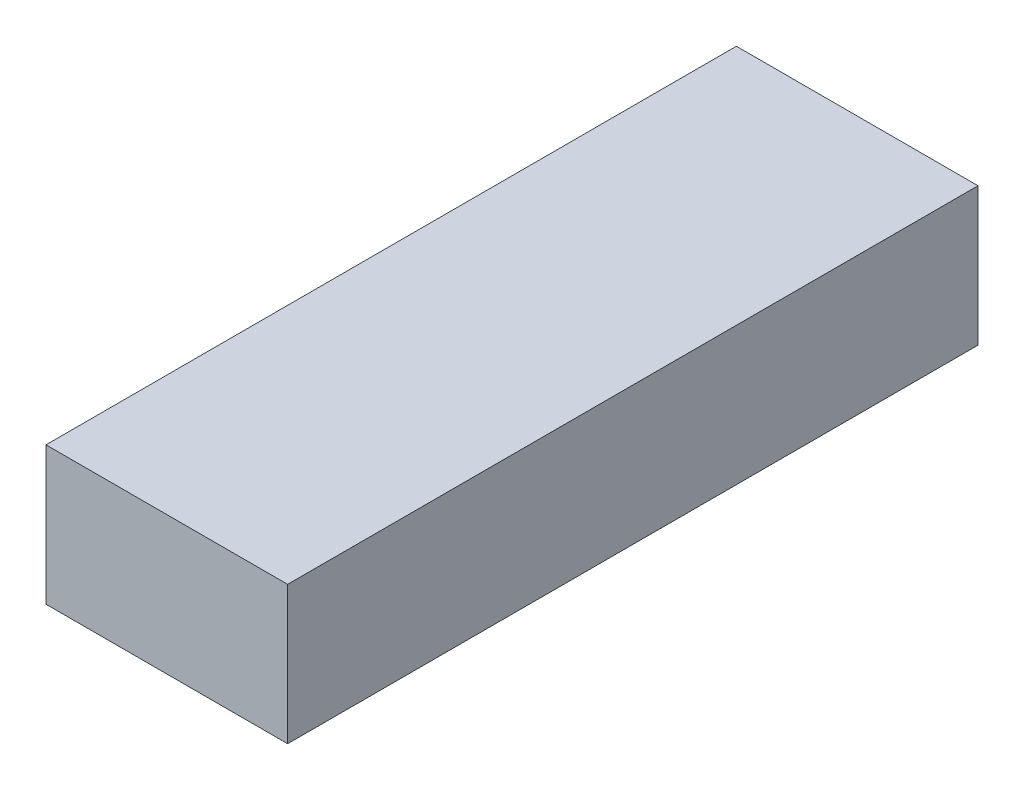
ISO-10303-21;
HEADER;
FILE_DESCRIPTION(('STEP AP214'),'2;1');
FILE_NAME('part.step','',(''),(''),'','','');
FILE_SCHEMA(('AUTOMOTIVE_DESIGN { 1 0 10303 214 1 1 1 1 }'));
ENDSEC;
DATA;
#1=APPLICATION_CONTEXT('core data for automotive mechanical design processes');
#2=APPLICATION_PROTOCOL_DEFINITION('international standard','automotive_design',2000,#1);
#3=PRODUCT_CONTEXT('',#1,'mechanical');
#4=PRODUCT('Part','Part','',(#3));
#5=PRODUCT_RELATED_PRODUCT_CATEGORY('part','',(#4));
#6=PRODUCT_DEFINITION_FORMATION('','',#4);
#7=PRODUCT_DEFINITION_CONTEXT('part definition',#1,'design');
#8=PRODUCT_DEFINITION('design','',#6,#7);
#9=PRODUCT_DEFINITION_SHAPE('','',#8);
#10=(LENGTH_UNIT() NAMED_UNIT(*) SI_UNIT(.MILLI.,.METRE.));
#11=(NAMED_UNIT(*) PLANE_ANGLE_UNIT() SI_UNIT($,.RADIAN.));
#12=(NAMED_UNIT(*) SI_UNIT($,.STERADIAN.) SOLID_ANGLE_UNIT());
#13=UNCERTAINTY_MEASURE_WITH_UNIT(LENGTH_MEASURE(1.E-05),#10,'distance_accuracy_value','');
#14=(GEOMETRIC_REPRESENTATION_CONTEXT(3) GLOBAL_UNCERTAINTY_ASSIGNED_CONTEXT((#13)) GLOBAL_UNIT_ASSIGNED_CONTEXT((#10,
#11,#12)) REPRESENTATION_CONTEXT('',''));
#15=CARTESIAN_POINT('',(0.,0.,0.));
#16=DIRECTION('',(0.,0.,1.));
#17=DIRECTION('',(1.,0.,0.));
#18=AXIS2_PLACEMENT_3D('',#15,#16,#17);
#19=CARTESIAN_POINT('',(0.,0.,12.7));
#20=DIRECTION('',(-1.,0.,0.));
#21=DIRECTION('',(0.,-1.,0.));
#22=AXIS2_PLACEMENT_3D('',#19,#20,#21);
#23=PLANE('',#22);
#24=DIRECTION('',(0.,1.,0.));
#25=VECTOR('',#24,1.);
#26=CARTESIAN_POINT('',(0.,0.,0.));
#27=LINE('',#26,#25);
#28=CARTESIAN_POINT('',(0.,0.,0.));
#29=VERTEX_POINT('',#28);
#30=CARTESIAN_POINT('',(0.,2.54,0.));
#31=VERTEX_POINT('',#30);
#32=EDGE_CURVE('E107',#29,#31,#27,.T.);
#33=ORIENTED_EDGE('',*,*,#32,.T.);
#34=DIRECTION('',(0.,0.,-1.));
#35=VECTOR('',#34,1.);
#36=CARTESIAN_POINT('',(0.,2.54,12.7));
#37=LINE('',#36,#35);
#38=CARTESIAN_POINT('',(0.,2.54,12.7));
#39=VERTEX_POINT('',#38);
#40=EDGE_CURVE('E11',#39,#31,#37,.T.);
#41=ORIENTED_EDGE('',*,*,#40,.F.);
#42=DIRECTION('',(0.,1.,0.));
#43=VECTOR('',#42,1.);
#44=CARTESIAN_POINT('',(0.,0.,12.7));
#45=LINE('',#44,#43);
#46=CARTESIAN_POINT('',(0.,0.,12.7));
#47=VERTEX_POINT('',#46);
#48=EDGE_CURVE('E91',#47,#39,#45,.T.);
#49=ORIENTED_EDGE('',*,*,#48,.F.);
#50=DIRECTION('',(0.,0.,-1.));
#51=VECTOR('',#50,1.);
#52=CARTESIAN_POINT('',(0.,0.,12.7));
#53=LINE('',#52,#51);
#54=EDGE_CURVE('E103',#47,#29,#53,.T.);
#55=ORIENTED_EDGE('',*,*,#54,.T.);
#56=EDGE_LOOP('',(#33,#41,#49,#55));
#57=FACE_BOUND('',#56,.T.);
#58=ADVANCED_FACE('F39',(#57),#23,.F.);
#59=CARTESIAN_POINT('',(0.,2.54,12.7));
#60=DIRECTION('',(0.,-1.,0.));
#61=DIRECTION('',(1.,0.,0.));
#62=AXIS2_PLACEMENT_3D('',#59,#60,#61);
#63=PLANE('',#62);
#64=DIRECTION('',(-1.,0.,0.));
#65=VECTOR('',#64,1.);
#66=CARTESIAN_POINT('',(0.,2.54,0.));
#67=LINE('',#66,#65);
#68=CARTESIAN_POINT('',(-4.445,2.54,0.));
#69=VERTEX_POINT('',#68);
#70=EDGE_CURVE('E96',#31,#69,#67,.T.);
#71=ORIENTED_EDGE('',*,*,#70,.T.);
#72=DIRECTION('',(0.,0.,-1.));
#73=VECTOR('',#72,1.);
#74=CARTESIAN_POINT('',(-4.445,2.54,12.7));
#75=LINE('',#74,#73);
#76=CARTESIAN_POINT('',(-4.445,2.54,12.7));
#77=VERTEX_POINT('',#76);
#78=EDGE_CURVE('E48',#77,#69,#75,.T.);
#79=ORIENTED_EDGE('',*,*,#78,.F.);
#80=DIRECTION('',(-1.,0.,0.));
#81=VECTOR('',#80,1.);
#82=CARTESIAN_POINT('',(0.,2.54,12.7));
#83=LINE('',#82,#81);
#84=EDGE_CURVE('E86',#39,#77,#83,.T.);
#85=ORIENTED_EDGE('',*,*,#84,.F.);
#86=ORIENTED_EDGE('',*,*,#40,.T.);
#87=EDGE_LOOP('',(#71,#79,#85,#86));
#88=FACE_BOUND('',#87,.T.);
#89=ADVANCED_FACE('F95',(#88),#63,.F.);
#90=CARTESIAN_POINT('',(-4.445,0.,12.7));
#91=DIRECTION('',(1.,0.,0.));
#92=DIRECTION('',(0.,0.,-1.));
#93=AXIS2_PLACEMENT_3D('',#90,#91,#92);
#94=PLANE('',#93);
#95=DIRECTION('',(0.,-1.,0.));
#96=VECTOR('',#95,1.);
#97=CARTESIAN_POINT('',(-4.445,0.,0.));
#98=LINE('',#97,#96);
#99=CARTESIAN_POINT('',(-4.445,0.,0.));
#100=VERTEX_POINT('',#99);
#101=EDGE_CURVE('E73',#69,#100,#98,.T.);
#102=ORIENTED_EDGE('',*,*,#101,.T.);
#103=DIRECTION('',(0.,0.,-1.));
#104=VECTOR('',#103,1.);
#105=CARTESIAN_POINT('',(-4.445,0.,12.7));
#106=LINE('',#105,#104);
#107=CARTESIAN_POINT('',(-4.445,0.,12.7));
#108=VERTEX_POINT('',#107);
#109=EDGE_CURVE('E98',#108,#100,#106,.T.);
#110=ORIENTED_EDGE('',*,*,#109,.F.);
#111=DIRECTION('',(0.,-1.,0.));
#112=VECTOR('',#111,1.);
#113=CARTESIAN_POINT('',(-4.445,0.,12.7));
#114=LINE('',#113,#112);
#115=EDGE_CURVE('E89',#77,#108,#114,.T.);
#116=ORIENTED_EDGE('',*,*,#115,.F.);
#117=ORIENTED_EDGE('',*,*,#78,.T.);
#118=EDGE_LOOP('',(#102,#110,#116,#117));
#119=FACE_BOUND('',#118,.T.);
#120=ADVANCED_FACE('F99',(#119),#94,.F.);
#121=CARTESIAN_POINT('',(0.,0.,12.7));
#122=DIRECTION('',(0.,1.,0.));
#123=DIRECTION('',(-1.,0.,0.));
#124=AXIS2_PLACEMENT_3D('',#121,#122,#123);
#125=PLANE('',#124);
#126=DIRECTION('',(1.,0.,0.));
#127=VECTOR('',#126,1.);
#128=CARTESIAN_POINT('',(0.,0.,0.));
#129=LINE('',#128,#127);
#130=EDGE_CURVE('E79',#100,#29,#129,.T.);
#131=ORIENTED_EDGE('',*,*,#130,.T.);
#132=ORIENTED_EDGE('',*,*,#54,.F.);
#133=DIRECTION('',(1.,0.,0.));
#134=VECTOR('',#133,1.);
#135=CARTESIAN_POINT('',(0.,0.,12.7));
#136=LINE('',#135,#134);
#137=EDGE_CURVE('E56',#108,#47,#136,.T.);
#138=ORIENTED_EDGE('',*,*,#137,.F.);
#139=ORIENTED_EDGE('',*,*,#109,.T.);
#140=EDGE_LOOP('',(#131,#132,#138,#139));
#141=FACE_BOUND('',#140,.T.);
#142=ADVANCED_FACE('F120',(#141),#125,.F.);
#143=CARTESIAN_POINT('',(0.,0.,12.7));
#144=DIRECTION('',(0.,0.,1.));
#145=DIRECTION('',(1.,0.,0.));
#146=AXIS2_PLACEMENT_3D('',#143,#144,#145);
#147=PLANE('',#146);
#148=ORIENTED_EDGE('',*,*,#48,.T.);
#149=ORIENTED_EDGE('',*,*,#84,.T.);
#150=ORIENTED_EDGE('',*,*,#115,.T.);
#151=ORIENTED_EDGE('',*,*,#137,.T.);
#152=EDGE_LOOP('',(#148,#149,#150,#151));
#153=FACE_BOUND('',#152,.T.);
#154=ADVANCED_FACE('F87',(#153),#147,.T.);
#155=CARTESIAN_POINT('',(0.,0.,0.));
#156=DIRECTION('',(0.,0.,1.));
#157=DIRECTION('',(1.,0.,0.));
#158=AXIS2_PLACEMENT_3D('',#155,#156,#157);
#159=PLANE('',#158);
#160=ORIENTED_EDGE('',*,*,#32,.F.);
#161=ORIENTED_EDGE('',*,*,#130,.F.);
#162=ORIENTED_EDGE('',*,*,#101,.F.);
#163=ORIENTED_EDGE('',*,*,#70,.F.);
#164=EDGE_LOOP('',(#160,#161,#162,#163));
#165=FACE_BOUND('',#164,.T.);
#166=ADVANCED_FACE('F123',(#165),#159,.F.);
#167=CLOSED_SHELL('',(#58,#89,#120,#142,#154,#166));
#168=MANIFOLD_SOLID_BREP('B2',#167);
#169=ADVANCED_BREP_SHAPE_REPRESENTATION('',(#18,#168),#14);
#170=SHAPE_DEFINITION_REPRESENTATION(#9,#169);
ENDSEC;
END-ISO-10303-21;
